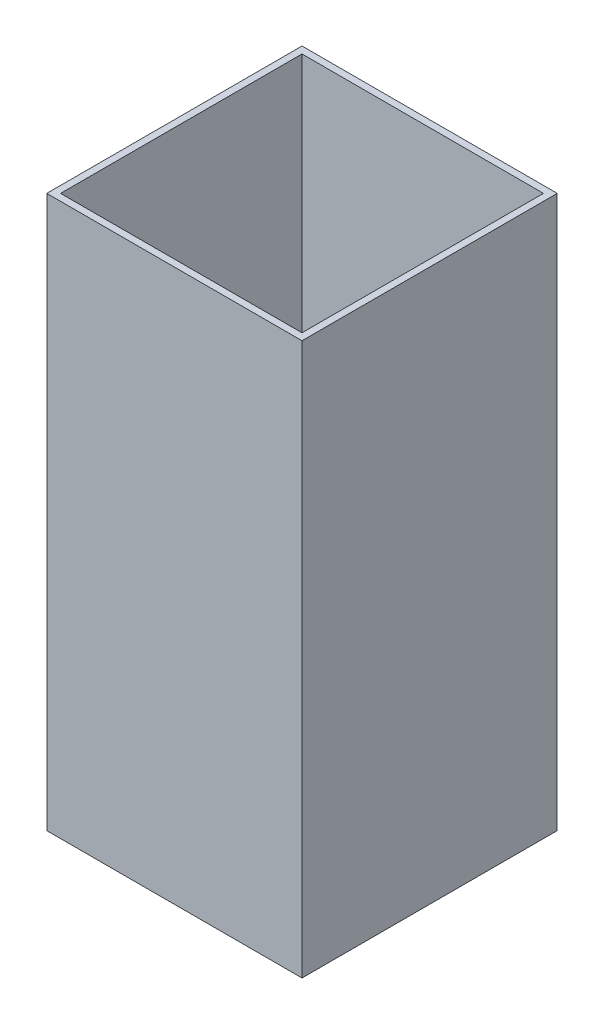
ISO-10303-21;
HEADER;
FILE_DESCRIPTION(('STEP AP214'),'2;1');
FILE_NAME('part.step','',(''),(''),'','','');
FILE_SCHEMA(('AUTOMOTIVE_DESIGN { 1 0 10303 214 1 1 1 1 }'));
ENDSEC;
DATA;
#1=APPLICATION_CONTEXT('core data for automotive mechanical design processes');
#2=APPLICATION_PROTOCOL_DEFINITION('international standard','automotive_design',2000,#1);
#3=PRODUCT_CONTEXT('',#1,'mechanical');
#4=PRODUCT('Part','Part','',(#3));
#5=PRODUCT_RELATED_PRODUCT_CATEGORY('part','',(#4));
#6=PRODUCT_DEFINITION_FORMATION('','',#4);
#7=PRODUCT_DEFINITION_CONTEXT('part definition',#1,'design');
#8=PRODUCT_DEFINITION('design','',#6,#7);
#9=PRODUCT_DEFINITION_SHAPE('','',#8);
#10=(LENGTH_UNIT() NAMED_UNIT(*) SI_UNIT(.MILLI.,.METRE.));
#11=(NAMED_UNIT(*) PLANE_ANGLE_UNIT() SI_UNIT($,.RADIAN.));
#12=(NAMED_UNIT(*) SI_UNIT($,.STERADIAN.) SOLID_ANGLE_UNIT());
#13=UNCERTAINTY_MEASURE_WITH_UNIT(LENGTH_MEASURE(1.E-05),#10,'distance_accuracy_value','');
#14=(GEOMETRIC_REPRESENTATION_CONTEXT(3) GLOBAL_UNCERTAINTY_ASSIGNED_CONTEXT((#13)) GLOBAL_UNIT_ASSIGNED_CONTEXT((#10,
#11,#12)) REPRESENTATION_CONTEXT('',''));
#15=CARTESIAN_POINT('',(0.,0.,0.));
#16=DIRECTION('',(0.,0.,1.));
#17=DIRECTION('',(1.,0.,0.));
#18=AXIS2_PLACEMENT_3D('',#15,#16,#17);
#19=CARTESIAN_POINT('',(0.,800.,0.));
#20=DIRECTION('',(0.,1.,0.));
#21=DIRECTION('',(0.,0.,1.));
#22=AXIS2_PLACEMENT_3D('',#19,#20,#21);
#23=PLANE('',#22);
#24=DIRECTION('',(0.,0.,1.));
#25=VECTOR('',#24,1.);
#26=CARTESIAN_POINT('',(-185.,800.,-185.));
#27=LINE('',#26,#25);
#28=CARTESIAN_POINT('',(-185.,800.,-185.));
#29=VERTEX_POINT('',#28);
#30=CARTESIAN_POINT('',(-185.,800.,185.));
#31=VERTEX_POINT('',#30);
#32=EDGE_CURVE('E134',#29,#31,#27,.T.);
#33=ORIENTED_EDGE('',*,*,#32,.T.);
#34=DIRECTION('',(1.,0.,0.));
#35=VECTOR('',#34,1.);
#36=CARTESIAN_POINT('',(-185.,800.,185.));
#37=LINE('',#36,#35);
#38=CARTESIAN_POINT('',(185.,800.,185.));
#39=VERTEX_POINT('',#38);
#40=EDGE_CURVE('E137',#31,#39,#37,.T.);
#41=ORIENTED_EDGE('',*,*,#40,.T.);
#42=DIRECTION('',(0.,0.,-1.));
#43=VECTOR('',#42,1.);
#44=CARTESIAN_POINT('',(185.,800.,-185.));
#45=LINE('',#44,#43);
#46=CARTESIAN_POINT('',(185.,800.,-185.));
#47=VERTEX_POINT('',#46);
#48=EDGE_CURVE('E140',#39,#47,#45,.T.);
#49=ORIENTED_EDGE('',*,*,#48,.T.);
#50=DIRECTION('',(-1.,0.,0.));
#51=VECTOR('',#50,1.);
#52=CARTESIAN_POINT('',(-185.,800.,-185.));
#53=LINE('',#52,#51);
#54=EDGE_CURVE('E142',#47,#29,#53,.T.);
#55=ORIENTED_EDGE('',*,*,#54,.T.);
#56=EDGE_LOOP('',(#33,#41,#49,#55));
#57=FACE_BOUND('',#56,.T.);
#58=DIRECTION('',(-1.,0.,0.));
#59=VECTOR('',#58,1.);
#60=CARTESIAN_POINT('',(-175.,800.,-175.));
#61=LINE('',#60,#59);
#62=CARTESIAN_POINT('',(175.,800.,-175.));
#63=VERTEX_POINT('',#62);
#64=CARTESIAN_POINT('',(-175.,800.,-175.));
#65=VERTEX_POINT('',#64);
#66=EDGE_CURVE('E106',#63,#65,#61,.T.);
#67=ORIENTED_EDGE('',*,*,#66,.F.);
#68=DIRECTION('',(0.,0.,-1.));
#69=VECTOR('',#68,1.);
#70=CARTESIAN_POINT('',(175.,800.,-175.));
#71=LINE('',#70,#69);
#72=CARTESIAN_POINT('',(175.,800.,175.));
#73=VERTEX_POINT('',#72);
#74=EDGE_CURVE('E98',#73,#63,#71,.T.);
#75=ORIENTED_EDGE('',*,*,#74,.F.);
#76=DIRECTION('',(1.,0.,0.));
#77=VECTOR('',#76,1.);
#78=CARTESIAN_POINT('',(-175.,800.,175.));
#79=LINE('',#78,#77);
#80=CARTESIAN_POINT('',(-175.,800.,175.));
#81=VERTEX_POINT('',#80);
#82=EDGE_CURVE('E120',#81,#73,#79,.T.);
#83=ORIENTED_EDGE('',*,*,#82,.F.);
#84=DIRECTION('',(0.,0.,1.));
#85=VECTOR('',#84,1.);
#86=CARTESIAN_POINT('',(-175.,800.,-175.));
#87=LINE('',#86,#85);
#88=EDGE_CURVE('E118',#65,#81,#87,.T.);
#89=ORIENTED_EDGE('',*,*,#88,.F.);
#90=EDGE_LOOP('',(#67,#75,#83,#89));
#91=FACE_BOUND('',#90,.T.);
#92=ADVANCED_FACE('F33',(#57,#91),#23,.T.);
#93=CARTESIAN_POINT('',(0.,0.,0.));
#94=DIRECTION('',(0.,1.,0.));
#95=DIRECTION('',(0.,0.,1.));
#96=AXIS2_PLACEMENT_3D('',#93,#94,#95);
#97=PLANE('',#96);
#98=DIRECTION('',(0.,0.,1.));
#99=VECTOR('',#98,1.);
#100=CARTESIAN_POINT('',(-185.,0.,-185.));
#101=LINE('',#100,#99);
#102=CARTESIAN_POINT('',(-185.,0.,-185.));
#103=VERTEX_POINT('',#102);
#104=CARTESIAN_POINT('',(-185.,0.,185.));
#105=VERTEX_POINT('',#104);
#106=EDGE_CURVE('E114',#103,#105,#101,.T.);
#107=ORIENTED_EDGE('',*,*,#106,.F.);
#108=DIRECTION('',(-1.,0.,0.));
#109=VECTOR('',#108,1.);
#110=CARTESIAN_POINT('',(-185.,0.,-185.));
#111=LINE('',#110,#109);
#112=CARTESIAN_POINT('',(185.,0.,-185.));
#113=VERTEX_POINT('',#112);
#114=EDGE_CURVE('E138',#113,#103,#111,.T.);
#115=ORIENTED_EDGE('',*,*,#114,.F.);
#116=DIRECTION('',(0.,0.,-1.));
#117=VECTOR('',#116,1.);
#118=CARTESIAN_POINT('',(185.,0.,-185.));
#119=LINE('',#118,#117);
#120=CARTESIAN_POINT('',(185.,0.,185.));
#121=VERTEX_POINT('',#120);
#122=EDGE_CURVE('E149',#121,#113,#119,.T.);
#123=ORIENTED_EDGE('',*,*,#122,.F.);
#124=DIRECTION('',(1.,0.,0.));
#125=VECTOR('',#124,1.);
#126=CARTESIAN_POINT('',(-185.,0.,185.));
#127=LINE('',#126,#125);
#128=EDGE_CURVE('E147',#105,#121,#127,.T.);
#129=ORIENTED_EDGE('',*,*,#128,.F.);
#130=EDGE_LOOP('',(#107,#115,#123,#129));
#131=FACE_BOUND('',#130,.T.);
#132=DIRECTION('',(0.,0.,-1.));
#133=VECTOR('',#132,1.);
#134=CARTESIAN_POINT('',(175.,0.,-175.));
#135=LINE('',#134,#133);
#136=CARTESIAN_POINT('',(175.,0.,175.));
#137=VERTEX_POINT('',#136);
#138=CARTESIAN_POINT('',(175.,0.,-175.));
#139=VERTEX_POINT('',#138);
#140=EDGE_CURVE('E56',#137,#139,#135,.T.);
#141=ORIENTED_EDGE('',*,*,#140,.T.);
#142=DIRECTION('',(-1.,0.,0.));
#143=VECTOR('',#142,1.);
#144=CARTESIAN_POINT('',(-175.,0.,-175.));
#145=LINE('',#144,#143);
#146=CARTESIAN_POINT('',(-175.,0.,-175.));
#147=VERTEX_POINT('',#146);
#148=EDGE_CURVE('E113',#139,#147,#145,.T.);
#149=ORIENTED_EDGE('',*,*,#148,.T.);
#150=DIRECTION('',(0.,0.,1.));
#151=VECTOR('',#150,1.);
#152=CARTESIAN_POINT('',(-175.,0.,-175.));
#153=LINE('',#152,#151);
#154=CARTESIAN_POINT('',(-175.,0.,175.));
#155=VERTEX_POINT('',#154);
#156=EDGE_CURVE('E126',#147,#155,#153,.T.);
#157=ORIENTED_EDGE('',*,*,#156,.T.);
#158=DIRECTION('',(1.,0.,0.));
#159=VECTOR('',#158,1.);
#160=CARTESIAN_POINT('',(-175.,0.,175.));
#161=LINE('',#160,#159);
#162=EDGE_CURVE('E107',#155,#137,#161,.T.);
#163=ORIENTED_EDGE('',*,*,#162,.T.);
#164=EDGE_LOOP('',(#141,#149,#157,#163));
#165=FACE_BOUND('',#164,.T.);
#166=ADVANCED_FACE('F167',(#131,#165),#97,.F.);
#167=CARTESIAN_POINT('',(-185.,800.,-185.));
#168=DIRECTION('',(1.,0.,0.));
#169=DIRECTION('',(0.,0.,-1.));
#170=AXIS2_PLACEMENT_3D('',#167,#168,#169);
#171=PLANE('',#170);
#172=ORIENTED_EDGE('',*,*,#106,.T.);
#173=DIRECTION('',(0.,-1.,0.));
#174=VECTOR('',#173,1.);
#175=CARTESIAN_POINT('',(-185.,800.,185.));
#176=LINE('',#175,#174);
#177=EDGE_CURVE('E11',#31,#105,#176,.T.);
#178=ORIENTED_EDGE('',*,*,#177,.F.);
#179=ORIENTED_EDGE('',*,*,#32,.F.);
#180=DIRECTION('',(0.,-1.,0.));
#181=VECTOR('',#180,1.);
#182=CARTESIAN_POINT('',(-185.,800.,-185.));
#183=LINE('',#182,#181);
#184=EDGE_CURVE('E144',#29,#103,#183,.T.);
#185=ORIENTED_EDGE('',*,*,#184,.T.);
#186=EDGE_LOOP('',(#172,#178,#179,#185));
#187=FACE_BOUND('',#186,.T.);
#188=ADVANCED_FACE('F35',(#187),#171,.F.);
#189=CARTESIAN_POINT('',(-185.,800.,185.));
#190=DIRECTION('',(0.,0.,-1.));
#191=DIRECTION('',(-1.,0.,0.));
#192=AXIS2_PLACEMENT_3D('',#189,#190,#191);
#193=PLANE('',#192);
#194=ORIENTED_EDGE('',*,*,#128,.T.);
#195=DIRECTION('',(0.,-1.,0.));
#196=VECTOR('',#195,1.);
#197=CARTESIAN_POINT('',(185.,800.,185.));
#198=LINE('',#197,#196);
#199=EDGE_CURVE('E41',#39,#121,#198,.T.);
#200=ORIENTED_EDGE('',*,*,#199,.F.);
#201=ORIENTED_EDGE('',*,*,#40,.F.);
#202=ORIENTED_EDGE('',*,*,#177,.T.);
#203=EDGE_LOOP('',(#194,#200,#201,#202));
#204=FACE_BOUND('',#203,.T.);
#205=ADVANCED_FACE('F177',(#204),#193,.F.);
#206=CARTESIAN_POINT('',(185.,800.,-185.));
#207=DIRECTION('',(-1.,0.,0.));
#208=DIRECTION('',(0.,0.,1.));
#209=AXIS2_PLACEMENT_3D('',#206,#207,#208);
#210=PLANE('',#209);
#211=ORIENTED_EDGE('',*,*,#122,.T.);
#212=DIRECTION('',(0.,-1.,0.));
#213=VECTOR('',#212,1.);
#214=CARTESIAN_POINT('',(185.,800.,-185.));
#215=LINE('',#214,#213);
#216=EDGE_CURVE('E154',#47,#113,#215,.T.);
#217=ORIENTED_EDGE('',*,*,#216,.F.);
#218=ORIENTED_EDGE('',*,*,#48,.F.);
#219=ORIENTED_EDGE('',*,*,#199,.T.);
#220=EDGE_LOOP('',(#211,#217,#218,#219));
#221=FACE_BOUND('',#220,.T.);
#222=ADVANCED_FACE('F161',(#221),#210,.F.);
#223=CARTESIAN_POINT('',(-185.,800.,-185.));
#224=DIRECTION('',(0.,0.,1.));
#225=DIRECTION('',(1.,0.,0.));
#226=AXIS2_PLACEMENT_3D('',#223,#224,#225);
#227=PLANE('',#226);
#228=ORIENTED_EDGE('',*,*,#114,.T.);
#229=ORIENTED_EDGE('',*,*,#184,.F.);
#230=ORIENTED_EDGE('',*,*,#54,.F.);
#231=ORIENTED_EDGE('',*,*,#216,.T.);
#232=EDGE_LOOP('',(#228,#229,#230,#231));
#233=FACE_BOUND('',#232,.T.);
#234=ADVANCED_FACE('F171',(#233),#227,.F.);
#235=CARTESIAN_POINT('',(175.,800.,-175.));
#236=DIRECTION('',(-1.,0.,0.));
#237=DIRECTION('',(0.,0.,1.));
#238=AXIS2_PLACEMENT_3D('',#235,#236,#237);
#239=PLANE('',#238);
#240=ORIENTED_EDGE('',*,*,#140,.F.);
#241=DIRECTION('',(0.,-1.,0.));
#242=VECTOR('',#241,1.);
#243=CARTESIAN_POINT('',(175.,800.,175.));
#244=LINE('',#243,#242);
#245=EDGE_CURVE('E102',#73,#137,#244,.T.);
#246=ORIENTED_EDGE('',*,*,#245,.F.);
#247=ORIENTED_EDGE('',*,*,#74,.T.);
#248=DIRECTION('',(0.,-1.,0.));
#249=VECTOR('',#248,1.);
#250=CARTESIAN_POINT('',(175.,800.,-175.));
#251=LINE('',#250,#249);
#252=EDGE_CURVE('E101',#63,#139,#251,.T.);
#253=ORIENTED_EDGE('',*,*,#252,.T.);
#254=EDGE_LOOP('',(#240,#246,#247,#253));
#255=FACE_BOUND('',#254,.T.);
#256=ADVANCED_FACE('F100',(#255),#239,.T.);
#257=CARTESIAN_POINT('',(-175.,800.,-175.));
#258=DIRECTION('',(0.,0.,1.));
#259=DIRECTION('',(1.,0.,0.));
#260=AXIS2_PLACEMENT_3D('',#257,#258,#259);
#261=PLANE('',#260);
#262=ORIENTED_EDGE('',*,*,#148,.F.);
#263=ORIENTED_EDGE('',*,*,#252,.F.);
#264=ORIENTED_EDGE('',*,*,#66,.T.);
#265=DIRECTION('',(0.,-1.,0.));
#266=VECTOR('',#265,1.);
#267=CARTESIAN_POINT('',(-175.,800.,-175.));
#268=LINE('',#267,#266);
#269=EDGE_CURVE('E115',#65,#147,#268,.T.);
#270=ORIENTED_EDGE('',*,*,#269,.T.);
#271=EDGE_LOOP('',(#262,#263,#264,#270));
#272=FACE_BOUND('',#271,.T.);
#273=ADVANCED_FACE('F110',(#272),#261,.T.);
#274=CARTESIAN_POINT('',(-175.,800.,-175.));
#275=DIRECTION('',(1.,0.,0.));
#276=DIRECTION('',(0.,0.,-1.));
#277=AXIS2_PLACEMENT_3D('',#274,#275,#276);
#278=PLANE('',#277);
#279=ORIENTED_EDGE('',*,*,#156,.F.);
#280=ORIENTED_EDGE('',*,*,#269,.F.);
#281=ORIENTED_EDGE('',*,*,#88,.T.);
#282=DIRECTION('',(0.,-1.,0.));
#283=VECTOR('',#282,1.);
#284=CARTESIAN_POINT('',(-175.,800.,175.));
#285=LINE('',#284,#283);
#286=EDGE_CURVE('E48',#81,#155,#285,.T.);
#287=ORIENTED_EDGE('',*,*,#286,.T.);
#288=EDGE_LOOP('',(#279,#280,#281,#287));
#289=FACE_BOUND('',#288,.T.);
#290=ADVANCED_FACE('F200',(#289),#278,.T.);
#291=CARTESIAN_POINT('',(-175.,800.,175.));
#292=DIRECTION('',(0.,0.,-1.));
#293=DIRECTION('',(-1.,0.,0.));
#294=AXIS2_PLACEMENT_3D('',#291,#292,#293);
#295=PLANE('',#294);
#296=ORIENTED_EDGE('',*,*,#162,.F.);
#297=ORIENTED_EDGE('',*,*,#286,.F.);
#298=ORIENTED_EDGE('',*,*,#82,.T.);
#299=ORIENTED_EDGE('',*,*,#245,.T.);
#300=EDGE_LOOP('',(#296,#297,#298,#299));
#301=FACE_BOUND('',#300,.T.);
#302=ADVANCED_FACE('F204',(#301),#295,.T.);
#303=CLOSED_SHELL('',(#92,#166,#188,#205,#222,#234,#256,#273,#290,#302));
#304=MANIFOLD_SOLID_BREP('B2',#303);
#305=ADVANCED_BREP_SHAPE_REPRESENTATION('',(#18,#304),#14);
#306=SHAPE_DEFINITION_REPRESENTATION(#9,#305);
ENDSEC;
END-ISO-10303-21;
